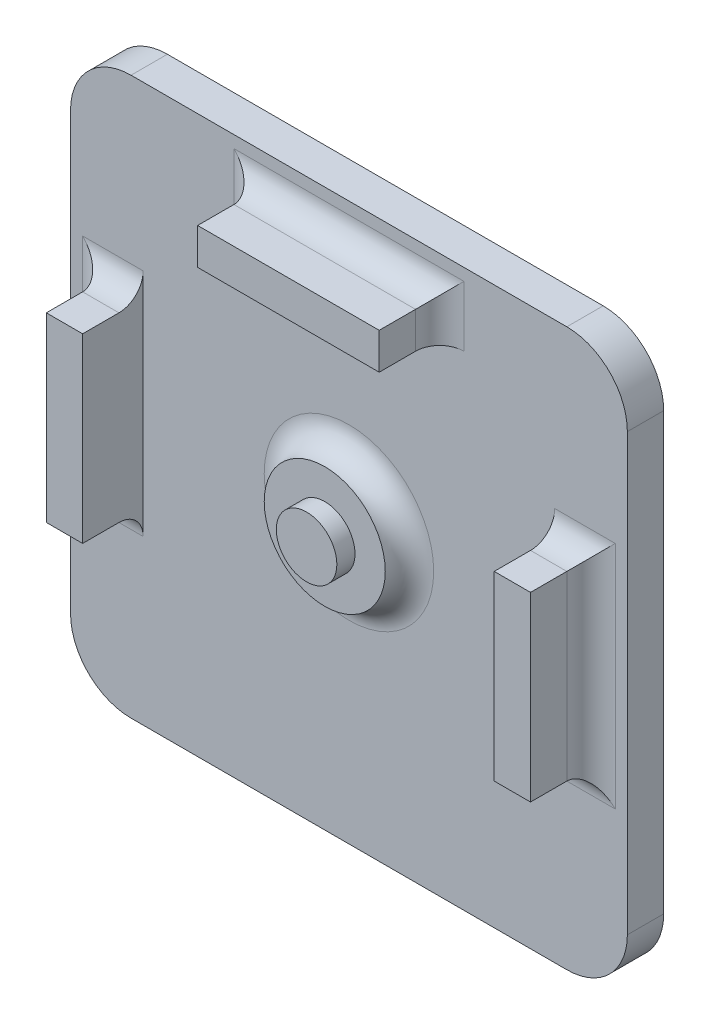
ISO-10303-21;
HEADER;
FILE_DESCRIPTION(('STEP AP214'),'2;1');
FILE_NAME('part.step','',(''),(''),'','','');
FILE_SCHEMA(('AUTOMOTIVE_DESIGN { 1 0 10303 214 1 1 1 1 }'));
ENDSEC;
DATA;
#1=APPLICATION_CONTEXT('core data for automotive mechanical design processes');
#2=APPLICATION_PROTOCOL_DEFINITION('international standard','automotive_design',2000,#1);
#3=PRODUCT_CONTEXT('',#1,'mechanical');
#4=PRODUCT('Part','Part','',(#3));
#5=PRODUCT_RELATED_PRODUCT_CATEGORY('part','',(#4));
#6=PRODUCT_DEFINITION_FORMATION('','',#4);
#7=PRODUCT_DEFINITION_CONTEXT('part definition',#1,'design');
#8=PRODUCT_DEFINITION('design','',#6,#7);
#9=PRODUCT_DEFINITION_SHAPE('','',#8);
#10=(LENGTH_UNIT() NAMED_UNIT(*) SI_UNIT(.MILLI.,.METRE.));
#11=(NAMED_UNIT(*) PLANE_ANGLE_UNIT() SI_UNIT($,.RADIAN.));
#12=(NAMED_UNIT(*) SI_UNIT($,.STERADIAN.) SOLID_ANGLE_UNIT());
#13=UNCERTAINTY_MEASURE_WITH_UNIT(LENGTH_MEASURE(1.E-05),#10,'distance_accuracy_value','');
#14=(GEOMETRIC_REPRESENTATION_CONTEXT(3) GLOBAL_UNCERTAINTY_ASSIGNED_CONTEXT((#13)) GLOBAL_UNIT_ASSIGNED_CONTEXT((#10,
#11,#12)) REPRESENTATION_CONTEXT('',''));
#15=CARTESIAN_POINT('',(0.,0.,0.));
#16=DIRECTION('',(0.,0.,1.));
#17=DIRECTION('',(1.,0.,0.));
#18=AXIS2_PLACEMENT_3D('',#15,#16,#17);
#19=CARTESIAN_POINT('',(0.,0.,3.));
#20=DIRECTION('',(0.,0.,-1.));
#21=DIRECTION('',(-1.,0.,0.));
#22=AXIS2_PLACEMENT_3D('',#19,#20,#21);
#23=PLANE('',#22);
#24=DIRECTION('',(0.,1.,0.));
#25=VECTOR('',#24,1.);
#26=CARTESIAN_POINT('',(32.5,40.,3.));
#27=LINE('',#26,#25);
#28=CARTESIAN_POINT('',(32.5,45.,3.));
#29=VERTEX_POINT('',#28);
#30=CARTESIAN_POINT('',(32.5,40.,3.));
#31=VERTEX_POINT('',#30);
#32=EDGE_CURVE('E430',#29,#31,#27,.F.);
#33=ORIENTED_EDGE('',*,*,#32,.T.);
#34=DIRECTION('',(1.,0.,0.));
#35=VECTOR('',#34,1.);
#36=CARTESIAN_POINT('',(15.5,40.,3.));
#37=LINE('',#36,#35);
#38=CARTESIAN_POINT('',(13.5,40.,3.));
#39=VERTEX_POINT('',#38);
#40=EDGE_CURVE('E273',#39,#31,#37,.T.);
#41=ORIENTED_EDGE('',*,*,#40,.F.);
#42=DIRECTION('',(0.,-1.,0.));
#43=VECTOR('',#42,1.);
#44=CARTESIAN_POINT('',(13.5,43.,3.));
#45=LINE('',#44,#43);
#46=CARTESIAN_POINT('',(13.5,45.,3.));
#47=VERTEX_POINT('',#46);
#48=EDGE_CURVE('E424',#39,#47,#45,.F.);
#49=ORIENTED_EDGE('',*,*,#48,.T.);
#50=DIRECTION('',(-1.,0.,0.));
#51=VECTOR('',#50,1.);
#52=CARTESIAN_POINT('',(30.5,45.,3.));
#53=LINE('',#52,#51);
#54=EDGE_CURVE('E427',#47,#29,#53,.F.);
#55=ORIENTED_EDGE('',*,*,#54,.T.);
#56=EDGE_LOOP('',(#33,#41,#49,#55));
#57=FACE_BOUND('',#56,.T.);
#58=DIRECTION('',(0.,-1.,0.));
#59=VECTOR('',#58,1.);
#60=CARTESIAN_POINT('',(0.,0.,3.));
#61=LINE('',#60,#59);
#62=CARTESIAN_POINT('',(0.,41.,3.));
#63=VERTEX_POINT('',#62);
#64=CARTESIAN_POINT('',(0.,5.,3.));
#65=VERTEX_POINT('',#64);
#66=EDGE_CURVE('E335',#63,#65,#61,.T.);
#67=ORIENTED_EDGE('',*,*,#66,.T.);
#68=CARTESIAN_POINT('',(5.,5.,3.));
#69=DIRECTION('',(0.,0.,-1.));
#70=DIRECTION('',(-1.,0.,0.));
#71=AXIS2_PLACEMENT_3D('',#68,#69,#70);
#72=CIRCLE('',#71,5.);
#73=CARTESIAN_POINT('',(5.,0.,3.));
#74=VERTEX_POINT('',#73);
#75=EDGE_CURVE('E399',#65,#74,#72,.F.);
#76=ORIENTED_EDGE('',*,*,#75,.T.);
#77=DIRECTION('',(1.,0.,0.));
#78=VECTOR('',#77,1.);
#79=CARTESIAN_POINT('',(0.,0.,3.));
#80=LINE('',#79,#78);
#81=CARTESIAN_POINT('',(41.,0.,3.));
#82=VERTEX_POINT('',#81);
#83=EDGE_CURVE('E339',#74,#82,#80,.T.);
#84=ORIENTED_EDGE('',*,*,#83,.T.);
#85=CARTESIAN_POINT('',(41.,5.,3.));
#86=DIRECTION('',(0.,0.,-1.));
#87=DIRECTION('',(-1.,0.,0.));
#88=AXIS2_PLACEMENT_3D('',#85,#86,#87);
#89=CIRCLE('',#88,5.);
#90=CARTESIAN_POINT('',(46.,5.,3.));
#91=VERTEX_POINT('',#90);
#92=EDGE_CURVE('E396',#82,#91,#89,.F.);
#93=ORIENTED_EDGE('',*,*,#92,.T.);
#94=DIRECTION('',(0.,1.,0.));
#95=VECTOR('',#94,1.);
#96=CARTESIAN_POINT('',(46.,0.,3.));
#97=LINE('',#96,#95);
#98=CARTESIAN_POINT('',(46.,41.,3.));
#99=VERTEX_POINT('',#98);
#100=EDGE_CURVE('E344',#91,#99,#97,.T.);
#101=ORIENTED_EDGE('',*,*,#100,.T.);
#102=CARTESIAN_POINT('',(41.,41.,3.));
#103=DIRECTION('',(0.,0.,-1.));
#104=DIRECTION('',(-1.,0.,0.));
#105=AXIS2_PLACEMENT_3D('',#102,#103,#104);
#106=CIRCLE('',#105,5.);
#107=CARTESIAN_POINT('',(41.,46.,3.));
#108=VERTEX_POINT('',#107);
#109=EDGE_CURVE('E393',#99,#108,#106,.F.);
#110=ORIENTED_EDGE('',*,*,#109,.T.);
#111=DIRECTION('',(-1.,0.,0.));
#112=VECTOR('',#111,1.);
#113=CARTESIAN_POINT('',(0.,46.,3.));
#114=LINE('',#113,#112);
#115=CARTESIAN_POINT('',(5.,46.,3.));
#116=VERTEX_POINT('',#115);
#117=EDGE_CURVE('E330',#108,#116,#114,.T.);
#118=ORIENTED_EDGE('',*,*,#117,.T.);
#119=CARTESIAN_POINT('',(5.,41.,3.));
#120=DIRECTION('',(0.,0.,-1.));
#121=DIRECTION('',(-1.,0.,0.));
#122=AXIS2_PLACEMENT_3D('',#119,#120,#121);
#123=CIRCLE('',#122,5.);
#124=EDGE_CURVE('E390',#116,#63,#123,.F.);
#125=ORIENTED_EDGE('',*,*,#124,.T.);
#126=EDGE_LOOP('',(#67,#76,#84,#93,#101,#110,#118,#125));
#127=FACE_BOUND('',#126,.T.);
#128=CARTESIAN_POINT('',(23.,23.,3.));
#129=DIRECTION('',(0.,0.,-1.));
#130=DIRECTION('',(-1.,0.,0.));
#131=AXIS2_PLACEMENT_3D('',#128,#129,#130);
#132=CIRCLE('',#131,7.);
#133=CARTESIAN_POINT('',(16.,23.,3.));
#134=VERTEX_POINT('',#133);
#135=EDGE_CURVE('E416',#134,#134,#132,.T.);
#136=ORIENTED_EDGE('',*,*,#135,.T.);
#137=EDGE_LOOP('',(#136));
#138=FACE_BOUND('',#137,.T.);
#139=DIRECTION('',(-1.,0.,0.));
#140=VECTOR('',#139,1.);
#141=CARTESIAN_POINT('',(5.99999999999999,32.5,3.));
#142=LINE('',#141,#140);
#143=CARTESIAN_POINT('',(0.999999999999992,32.5,3.));
#144=VERTEX_POINT('',#143);
#145=CARTESIAN_POINT('',(5.99999999999999,32.5,3.));
#146=VERTEX_POINT('',#145);
#147=EDGE_CURVE('E450',#144,#146,#142,.F.);
#148=ORIENTED_EDGE('',*,*,#147,.T.);
#149=DIRECTION('',(0.,1.,0.));
#150=VECTOR('',#149,1.);
#151=CARTESIAN_POINT('',(5.99999999999999,30.5,3.));
#152=LINE('',#151,#150);
#153=CARTESIAN_POINT('',(5.99999999999999,13.5,3.));
#154=VERTEX_POINT('',#153);
#155=EDGE_CURVE('E276',#154,#146,#152,.T.);
#156=ORIENTED_EDGE('',*,*,#155,.F.);
#157=DIRECTION('',(1.,0.,0.));
#158=VECTOR('',#157,1.);
#159=CARTESIAN_POINT('',(2.99999999999999,13.5,3.));
#160=LINE('',#159,#158);
#161=CARTESIAN_POINT('',(0.999999999999995,13.5,3.));
#162=VERTEX_POINT('',#161);
#163=EDGE_CURVE('E444',#154,#162,#160,.F.);
#164=ORIENTED_EDGE('',*,*,#163,.T.);
#165=DIRECTION('',(0.,-1.,0.));
#166=VECTOR('',#165,1.);
#167=CARTESIAN_POINT('',(0.999999999999993,30.5,3.));
#168=LINE('',#167,#166);
#169=EDGE_CURVE('E447',#162,#144,#168,.F.);
#170=ORIENTED_EDGE('',*,*,#169,.T.);
#171=EDGE_LOOP('',(#148,#156,#164,#170));
#172=FACE_BOUND('',#171,.T.);
#173=DIRECTION('',(1.,0.,0.));
#174=VECTOR('',#173,1.);
#175=CARTESIAN_POINT('',(40.,13.5,3.));
#176=LINE('',#175,#174);
#177=CARTESIAN_POINT('',(45.,13.5,3.));
#178=VERTEX_POINT('',#177);
#179=CARTESIAN_POINT('',(40.,13.5,3.));
#180=VERTEX_POINT('',#179);
#181=EDGE_CURVE('E440',#178,#180,#176,.F.);
#182=ORIENTED_EDGE('',*,*,#181,.T.);
#183=DIRECTION('',(0.,-1.,0.));
#184=VECTOR('',#183,1.);
#185=CARTESIAN_POINT('',(40.,30.5,3.));
#186=LINE('',#185,#184);
#187=CARTESIAN_POINT('',(40.,32.5,3.));
#188=VERTEX_POINT('',#187);
#189=EDGE_CURVE('E250',#188,#180,#186,.T.);
#190=ORIENTED_EDGE('',*,*,#189,.F.);
#191=DIRECTION('',(-1.,0.,0.));
#192=VECTOR('',#191,1.);
#193=CARTESIAN_POINT('',(43.,32.5,3.));
#194=LINE('',#193,#192);
#195=CARTESIAN_POINT('',(45.,32.5,3.));
#196=VERTEX_POINT('',#195);
#197=EDGE_CURVE('E437',#188,#196,#194,.F.);
#198=ORIENTED_EDGE('',*,*,#197,.T.);
#199=DIRECTION('',(0.,1.,0.));
#200=VECTOR('',#199,1.);
#201=CARTESIAN_POINT('',(45.,15.5,3.));
#202=LINE('',#201,#200);
#203=EDGE_CURVE('E434',#196,#178,#202,.F.);
#204=ORIENTED_EDGE('',*,*,#203,.T.);
#205=EDGE_LOOP('',(#182,#190,#198,#204));
#206=FACE_BOUND('',#205,.T.);
#207=ADVANCED_FACE('F43',(#57,#127,#138,#172,#206),#23,.F.);
#208=CARTESIAN_POINT('',(0.,0.,3.));
#209=DIRECTION('',(1.,0.,0.));
#210=DIRECTION('',(0.,0.,-1.));
#211=AXIS2_PLACEMENT_3D('',#208,#209,#210);
#212=PLANE('',#211);
#213=DIRECTION('',(0.,-1.,0.));
#214=VECTOR('',#213,1.);
#215=CARTESIAN_POINT('',(0.,0.,0.));
#216=LINE('',#215,#214);
#217=CARTESIAN_POINT('',(0.,41.,0.));
#218=VERTEX_POINT('',#217);
#219=CARTESIAN_POINT('',(0.,5.,0.));
#220=VERTEX_POINT('',#219);
#221=EDGE_CURVE('E334',#218,#220,#216,.T.);
#222=ORIENTED_EDGE('',*,*,#221,.T.);
#223=DIRECTION('',(0.,0.,-1.));
#224=VECTOR('',#223,1.);
#225=CARTESIAN_POINT('',(0.,5.,3.));
#226=LINE('',#225,#224);
#227=EDGE_CURVE('E387',#220,#65,#226,.F.);
#228=ORIENTED_EDGE('',*,*,#227,.T.);
#229=ORIENTED_EDGE('',*,*,#66,.F.);
#230=DIRECTION('',(0.,0.,-1.));
#231=VECTOR('',#230,1.);
#232=CARTESIAN_POINT('',(0.,41.,3.));
#233=LINE('',#232,#231);
#234=EDGE_CURVE('E383',#63,#218,#233,.T.);
#235=ORIENTED_EDGE('',*,*,#234,.T.);
#236=EDGE_LOOP('',(#222,#228,#229,#235));
#237=FACE_BOUND('',#236,.T.);
#238=ADVANCED_FACE('F542',(#237),#212,.F.);
#239=CARTESIAN_POINT('',(0.,0.,3.));
#240=DIRECTION('',(0.,1.,0.));
#241=DIRECTION('',(0.,0.,1.));
#242=AXIS2_PLACEMENT_3D('',#239,#240,#241);
#243=PLANE('',#242);
#244=ORIENTED_EDGE('',*,*,#83,.F.);
#245=DIRECTION('',(0.,0.,-1.));
#246=VECTOR('',#245,1.);
#247=CARTESIAN_POINT('',(5.,0.,3.));
#248=LINE('',#247,#246);
#249=CARTESIAN_POINT('',(5.,0.,0.));
#250=VERTEX_POINT('',#249);
#251=EDGE_CURVE('E367',#74,#250,#248,.T.);
#252=ORIENTED_EDGE('',*,*,#251,.T.);
#253=DIRECTION('',(1.,0.,0.));
#254=VECTOR('',#253,1.);
#255=CARTESIAN_POINT('',(0.,0.,0.));
#256=LINE('',#255,#254);
#257=CARTESIAN_POINT('',(41.,0.,0.));
#258=VERTEX_POINT('',#257);
#259=EDGE_CURVE('E354',#250,#258,#256,.T.);
#260=ORIENTED_EDGE('',*,*,#259,.T.);
#261=DIRECTION('',(0.,0.,-1.));
#262=VECTOR('',#261,1.);
#263=CARTESIAN_POINT('',(41.,0.,3.));
#264=LINE('',#263,#262);
#265=EDGE_CURVE('E329',#258,#82,#264,.F.);
#266=ORIENTED_EDGE('',*,*,#265,.T.);
#267=EDGE_LOOP('',(#244,#252,#260,#266));
#268=FACE_BOUND('',#267,.T.);
#269=ADVANCED_FACE('F550',(#268),#243,.F.);
#270=CARTESIAN_POINT('',(46.,0.,3.));
#271=DIRECTION('',(-1.,0.,0.));
#272=DIRECTION('',(0.,0.,1.));
#273=AXIS2_PLACEMENT_3D('',#270,#271,#272);
#274=PLANE('',#273);
#275=ORIENTED_EDGE('',*,*,#100,.F.);
#276=DIRECTION('',(0.,0.,-1.));
#277=VECTOR('',#276,1.);
#278=CARTESIAN_POINT('',(46.,5.,3.));
#279=LINE('',#278,#277);
#280=CARTESIAN_POINT('',(46.,5.,0.));
#281=VERTEX_POINT('',#280);
#282=EDGE_CURVE('E405',#91,#281,#279,.T.);
#283=ORIENTED_EDGE('',*,*,#282,.T.);
#284=DIRECTION('',(0.,1.,0.));
#285=VECTOR('',#284,1.);
#286=CARTESIAN_POINT('',(46.,0.,0.));
#287=LINE('',#286,#285);
#288=CARTESIAN_POINT('',(46.,41.,0.));
#289=VERTEX_POINT('',#288);
#290=EDGE_CURVE('E358',#281,#289,#287,.T.);
#291=ORIENTED_EDGE('',*,*,#290,.T.);
#292=DIRECTION('',(0.,0.,-1.));
#293=VECTOR('',#292,1.);
#294=CARTESIAN_POINT('',(46.,41.,3.));
#295=LINE('',#294,#293);
#296=EDGE_CURVE('E402',#289,#99,#295,.F.);
#297=ORIENTED_EDGE('',*,*,#296,.T.);
#298=EDGE_LOOP('',(#275,#283,#291,#297));
#299=FACE_BOUND('',#298,.T.);
#300=ADVANCED_FACE('F565',(#299),#274,.F.);
#301=CARTESIAN_POINT('',(0.,46.,3.));
#302=DIRECTION('',(0.,-1.,0.));
#303=DIRECTION('',(0.,0.,-1.));
#304=AXIS2_PLACEMENT_3D('',#301,#302,#303);
#305=PLANE('',#304);
#306=ORIENTED_EDGE('',*,*,#117,.F.);
#307=DIRECTION('',(0.,0.,-1.));
#308=VECTOR('',#307,1.);
#309=CARTESIAN_POINT('',(41.,46.,3.));
#310=LINE('',#309,#308);
#311=CARTESIAN_POINT('',(41.,46.,0.));
#312=VERTEX_POINT('',#311);
#313=EDGE_CURVE('E412',#108,#312,#310,.T.);
#314=ORIENTED_EDGE('',*,*,#313,.T.);
#315=DIRECTION('',(-1.,0.,0.));
#316=VECTOR('',#315,1.);
#317=CARTESIAN_POINT('',(0.,46.,0.));
#318=LINE('',#317,#316);
#319=CARTESIAN_POINT('',(5.,46.,0.));
#320=VERTEX_POINT('',#319);
#321=EDGE_CURVE('E340',#312,#320,#318,.T.);
#322=ORIENTED_EDGE('',*,*,#321,.T.);
#323=DIRECTION('',(0.,0.,-1.));
#324=VECTOR('',#323,1.);
#325=CARTESIAN_POINT('',(5.,46.,3.));
#326=LINE('',#325,#324);
#327=EDGE_CURVE('E409',#320,#116,#326,.F.);
#328=ORIENTED_EDGE('',*,*,#327,.T.);
#329=EDGE_LOOP('',(#306,#314,#322,#328));
#330=FACE_BOUND('',#329,.T.);
#331=ADVANCED_FACE('F561',(#330),#305,.F.);
#332=CARTESIAN_POINT('',(0.,0.,0.));
#333=DIRECTION('',(0.,0.,-1.));
#334=DIRECTION('',(-1.,0.,0.));
#335=AXIS2_PLACEMENT_3D('',#332,#333,#334);
#336=PLANE('',#335);
#337=ORIENTED_EDGE('',*,*,#259,.F.);
#338=CARTESIAN_POINT('',(5.,5.,0.));
#339=DIRECTION('',(0.,0.,-1.));
#340=DIRECTION('',(-1.,0.,0.));
#341=AXIS2_PLACEMENT_3D('',#338,#339,#340);
#342=CIRCLE('',#341,5.);
#343=EDGE_CURVE('E380',#250,#220,#342,.T.);
#344=ORIENTED_EDGE('',*,*,#343,.T.);
#345=ORIENTED_EDGE('',*,*,#221,.F.);
#346=CARTESIAN_POINT('',(5.,41.,0.));
#347=DIRECTION('',(0.,0.,-1.));
#348=DIRECTION('',(-1.,0.,0.));
#349=AXIS2_PLACEMENT_3D('',#346,#347,#348);
#350=CIRCLE('',#349,5.);
#351=EDGE_CURVE('E371',#218,#320,#350,.T.);
#352=ORIENTED_EDGE('',*,*,#351,.T.);
#353=ORIENTED_EDGE('',*,*,#321,.F.);
#354=CARTESIAN_POINT('',(41.,41.,0.));
#355=DIRECTION('',(0.,0.,-1.));
#356=DIRECTION('',(-1.,0.,0.));
#357=AXIS2_PLACEMENT_3D('',#354,#355,#356);
#358=CIRCLE('',#357,5.);
#359=EDGE_CURVE('E374',#312,#289,#358,.T.);
#360=ORIENTED_EDGE('',*,*,#359,.T.);
#361=ORIENTED_EDGE('',*,*,#290,.F.);
#362=CARTESIAN_POINT('',(41.,5.,0.));
#363=DIRECTION('',(0.,0.,-1.));
#364=DIRECTION('',(-1.,0.,0.));
#365=AXIS2_PLACEMENT_3D('',#362,#363,#364);
#366=CIRCLE('',#365,5.);
#367=EDGE_CURVE('E377',#281,#258,#366,.T.);
#368=ORIENTED_EDGE('',*,*,#367,.T.);
#369=EDGE_LOOP('',(#337,#344,#345,#352,#353,#360,#361,#368));
#370=FACE_BOUND('',#369,.T.);
#371=ADVANCED_FACE('F558',(#370),#336,.T.);
#372=CARTESIAN_POINT('',(23.,23.,5.));
#373=DIRECTION('',(0.,0.,1.));
#374=DIRECTION('',(1.,0.,0.));
#375=AXIS2_PLACEMENT_3D('',#372,#373,#374);
#376=PLANE('',#375);
#377=CARTESIAN_POINT('',(23.,23.,5.));
#378=DIRECTION('',(0.,0.,1.));
#379=DIRECTION('',(1.,0.,0.));
#380=AXIS2_PLACEMENT_3D('',#377,#378,#379);
#381=CIRCLE('',#380,2.5);
#382=CARTESIAN_POINT('',(25.5,23.,5.));
#383=VERTEX_POINT('',#382);
#384=EDGE_CURVE('E325',#383,#383,#381,.T.);
#385=ORIENTED_EDGE('',*,*,#384,.F.);
#386=EDGE_LOOP('',(#385));
#387=FACE_BOUND('',#386,.T.);
#388=CARTESIAN_POINT('',(23.,23.,5.));
#389=DIRECTION('',(0.,0.,1.));
#390=DIRECTION('',(1.,0.,0.));
#391=AXIS2_PLACEMENT_3D('',#388,#389,#390);
#392=CIRCLE('',#391,5.);
#393=CARTESIAN_POINT('',(28.,23.,5.));
#394=VERTEX_POINT('',#393);
#395=EDGE_CURVE('E324',#394,#394,#392,.T.);
#396=ORIENTED_EDGE('',*,*,#395,.T.);
#397=EDGE_LOOP('',(#396));
#398=FACE_BOUND('',#397,.T.);
#399=ADVANCED_FACE('F556',(#387,#398),#376,.T.);
#400=CARTESIAN_POINT('',(23.,23.,6.5));
#401=DIRECTION('',(0.,0.,-1.));
#402=DIRECTION('',(-1.,0.,0.));
#403=AXIS2_PLACEMENT_3D('',#400,#401,#402);
#404=CYLINDRICAL_SURFACE('',#403,2.5);
#405=CARTESIAN_POINT('',(23.,23.,6.5));
#406=DIRECTION('',(0.,0.,1.));
#407=DIRECTION('',(1.,0.,0.));
#408=AXIS2_PLACEMENT_3D('',#405,#406,#407);
#409=CIRCLE('',#408,2.5);
#410=CARTESIAN_POINT('',(25.5,23.,6.5));
#411=VERTEX_POINT('',#410);
#412=EDGE_CURVE('E320',#411,#411,#409,.T.);
#413=ORIENTED_EDGE('',*,*,#412,.F.);
#414=EDGE_LOOP('',(#413));
#415=FACE_BOUND('',#414,.T.);
#416=ORIENTED_EDGE('',*,*,#384,.T.);
#417=EDGE_LOOP('',(#416));
#418=FACE_BOUND('',#417,.T.);
#419=ADVANCED_FACE('F773',(#415,#418),#404,.T.);
#420=CARTESIAN_POINT('',(23.,23.,6.5));
#421=DIRECTION('',(0.,0.,1.));
#422=DIRECTION('',(1.,0.,0.));
#423=AXIS2_PLACEMENT_3D('',#420,#421,#422);
#424=PLANE('',#423);
#425=ORIENTED_EDGE('',*,*,#412,.T.);
#426=EDGE_LOOP('',(#425));
#427=FACE_BOUND('',#426,.T.);
#428=ADVANCED_FACE('F577',(#427),#424,.T.);
#429=CARTESIAN_POINT('',(5.,5.,3.));
#430=DIRECTION('',(0.,0.,-1.));
#431=DIRECTION('',(-1.,0.,0.));
#432=AXIS2_PLACEMENT_3D('',#429,#430,#431);
#433=CYLINDRICAL_SURFACE('',#432,5.);
#434=ORIENTED_EDGE('',*,*,#75,.F.);
#435=ORIENTED_EDGE('',*,*,#227,.F.);
#436=ORIENTED_EDGE('',*,*,#343,.F.);
#437=ORIENTED_EDGE('',*,*,#251,.F.);
#438=EDGE_LOOP('',(#434,#435,#436,#437));
#439=FACE_BOUND('',#438,.T.);
#440=ADVANCED_FACE('F573',(#439),#433,.T.);
#441=CARTESIAN_POINT('',(41.,5.,3.));
#442=DIRECTION('',(0.,0.,-1.));
#443=DIRECTION('',(-1.,0.,0.));
#444=AXIS2_PLACEMENT_3D('',#441,#442,#443);
#445=CYLINDRICAL_SURFACE('',#444,5.);
#446=ORIENTED_EDGE('',*,*,#92,.F.);
#447=ORIENTED_EDGE('',*,*,#265,.F.);
#448=ORIENTED_EDGE('',*,*,#367,.F.);
#449=ORIENTED_EDGE('',*,*,#282,.F.);
#450=EDGE_LOOP('',(#446,#447,#448,#449));
#451=FACE_BOUND('',#450,.T.);
#452=ADVANCED_FACE('F576',(#451),#445,.T.);
#453=CARTESIAN_POINT('',(41.,41.,3.));
#454=DIRECTION('',(0.,0.,-1.));
#455=DIRECTION('',(-1.,0.,0.));
#456=AXIS2_PLACEMENT_3D('',#453,#454,#455);
#457=CYLINDRICAL_SURFACE('',#456,5.);
#458=ORIENTED_EDGE('',*,*,#109,.F.);
#459=ORIENTED_EDGE('',*,*,#296,.F.);
#460=ORIENTED_EDGE('',*,*,#359,.F.);
#461=ORIENTED_EDGE('',*,*,#313,.F.);
#462=EDGE_LOOP('',(#458,#459,#460,#461));
#463=FACE_BOUND('',#462,.T.);
#464=ADVANCED_FACE('F581',(#463),#457,.T.);
#465=CARTESIAN_POINT('',(5.,41.,3.));
#466=DIRECTION('',(0.,0.,-1.));
#467=DIRECTION('',(-1.,0.,0.));
#468=AXIS2_PLACEMENT_3D('',#465,#466,#467);
#469=CYLINDRICAL_SURFACE('',#468,5.);
#470=ORIENTED_EDGE('',*,*,#124,.F.);
#471=ORIENTED_EDGE('',*,*,#327,.F.);
#472=ORIENTED_EDGE('',*,*,#351,.F.);
#473=ORIENTED_EDGE('',*,*,#234,.F.);
#474=EDGE_LOOP('',(#470,#471,#472,#473));
#475=FACE_BOUND('',#474,.T.);
#476=ADVANCED_FACE('F585',(#475),#469,.T.);
#477=CARTESIAN_POINT('',(23.,23.,5.));
#478=DIRECTION('',(0.,0.,-1.));
#479=DIRECTION('',(-1.,0.,0.));
#480=AXIS2_PLACEMENT_3D('',#477,#478,#479);
#481=TOROIDAL_SURFACE('',#480,7.,2.);
#482=ORIENTED_EDGE('',*,*,#135,.F.);
#483=EDGE_LOOP('',(#482));
#484=FACE_BOUND('',#483,.T.);
#485=ORIENTED_EDGE('',*,*,#395,.F.);
#486=EDGE_LOOP('',(#485));
#487=FACE_BOUND('',#486,.T.);
#488=ADVANCED_FACE('F589',(#484,#487),#481,.F.);
#489=CARTESIAN_POINT('',(5.99999999999999,30.5,8.));
#490=DIRECTION('',(-1.,0.,0.));
#491=DIRECTION('',(0.,-1.,0.));
#492=AXIS2_PLACEMENT_3D('',#489,#490,#491);
#493=PLANE('',#492);
#494=ORIENTED_EDGE('',*,*,#155,.T.);
#495=CARTESIAN_POINT('',(5.99999999999999,32.5,5.));
#496=DIRECTION('',(-1.,0.,0.));
#497=DIRECTION('',(0.,-1.,0.));
#498=AXIS2_PLACEMENT_3D('',#495,#496,#497);
#499=CIRCLE('',#498,2.);
#500=CARTESIAN_POINT('',(5.99999999999999,30.5,5.));
#501=VERTEX_POINT('',#500);
#502=EDGE_CURVE('E477',#146,#501,#499,.T.);
#503=ORIENTED_EDGE('',*,*,#502,.T.);
#504=DIRECTION('',(0.,0.,-1.));
#505=VECTOR('',#504,1.);
#506=CARTESIAN_POINT('',(5.99999999999999,30.5,8.));
#507=LINE('',#506,#505);
#508=CARTESIAN_POINT('',(5.99999999999999,30.5,8.));
#509=VERTEX_POINT('',#508);
#510=EDGE_CURVE('E316',#509,#501,#507,.T.);
#511=ORIENTED_EDGE('',*,*,#510,.F.);
#512=DIRECTION('',(0.,1.,0.));
#513=VECTOR('',#512,1.);
#514=CARTESIAN_POINT('',(5.99999999999999,30.5,8.));
#515=LINE('',#514,#513);
#516=CARTESIAN_POINT('',(5.99999999999999,15.5,8.));
#517=VERTEX_POINT('',#516);
#518=EDGE_CURVE('E289',#517,#509,#515,.T.);
#519=ORIENTED_EDGE('',*,*,#518,.F.);
#520=DIRECTION('',(0.,0.,-1.));
#521=VECTOR('',#520,1.);
#522=CARTESIAN_POINT('',(5.99999999999999,15.5,8.));
#523=LINE('',#522,#521);
#524=CARTESIAN_POINT('',(5.99999999999999,15.5,5.));
#525=VERTEX_POINT('',#524);
#526=EDGE_CURVE('E302',#517,#525,#523,.T.);
#527=ORIENTED_EDGE('',*,*,#526,.T.);
#528=CARTESIAN_POINT('',(5.99999999999999,13.5,5.));
#529=DIRECTION('',(-1.,0.,0.));
#530=DIRECTION('',(0.,-1.,0.));
#531=AXIS2_PLACEMENT_3D('',#528,#529,#530);
#532=CIRCLE('',#531,2.);
#533=EDGE_CURVE('E480',#525,#154,#532,.T.);
#534=ORIENTED_EDGE('',*,*,#533,.T.);
#535=EDGE_LOOP('',(#494,#503,#511,#519,#527,#534));
#536=FACE_BOUND('',#535,.T.);
#537=ADVANCED_FACE('F593',(#536),#493,.F.);
#538=CARTESIAN_POINT('',(5.99999999999999,30.5,8.));
#539=DIRECTION('',(0.,-1.,0.));
#540=DIRECTION('',(0.,0.,-1.));
#541=AXIS2_PLACEMENT_3D('',#538,#539,#540);
#542=PLANE('',#541);
#543=ORIENTED_EDGE('',*,*,#510,.T.);
#544=DIRECTION('',(-1.,0.,0.));
#545=VECTOR('',#544,1.);
#546=CARTESIAN_POINT('',(2.99999999999999,30.5,5.));
#547=LINE('',#546,#545);
#548=CARTESIAN_POINT('',(2.99999999999999,30.5,5.));
#549=VERTEX_POINT('',#548);
#550=EDGE_CURVE('E420',#501,#549,#547,.T.);
#551=ORIENTED_EDGE('',*,*,#550,.T.);
#552=DIRECTION('',(0.,0.,-1.));
#553=VECTOR('',#552,1.);
#554=CARTESIAN_POINT('',(2.99999999999999,30.5,8.));
#555=LINE('',#554,#553);
#556=CARTESIAN_POINT('',(2.99999999999999,30.5,8.));
#557=VERTEX_POINT('',#556);
#558=EDGE_CURVE('E312',#557,#549,#555,.T.);
#559=ORIENTED_EDGE('',*,*,#558,.F.);
#560=DIRECTION('',(-1.,0.,0.));
#561=VECTOR('',#560,1.);
#562=CARTESIAN_POINT('',(5.99999999999999,30.5,8.));
#563=LINE('',#562,#561);
#564=EDGE_CURVE('E293',#509,#557,#563,.T.);
#565=ORIENTED_EDGE('',*,*,#564,.F.);
#566=EDGE_LOOP('',(#543,#551,#559,#565));
#567=FACE_BOUND('',#566,.T.);
#568=ADVANCED_FACE('F832',(#567),#542,.F.);
#569=CARTESIAN_POINT('',(2.99999999999999,30.5,8.));
#570=DIRECTION('',(1.,0.,0.));
#571=DIRECTION('',(0.,1.,0.));
#572=AXIS2_PLACEMENT_3D('',#569,#570,#571);
#573=PLANE('',#572);
#574=ORIENTED_EDGE('',*,*,#558,.T.);
#575=DIRECTION('',(0.,-1.,0.));
#576=VECTOR('',#575,1.);
#577=CARTESIAN_POINT('',(2.99999999999999,15.5,5.));
#578=LINE('',#577,#576);
#579=CARTESIAN_POINT('',(2.99999999999999,15.5,5.));
#580=VERTEX_POINT('',#579);
#581=EDGE_CURVE('E454',#549,#580,#578,.T.);
#582=ORIENTED_EDGE('',*,*,#581,.T.);
#583=DIRECTION('',(0.,0.,-1.));
#584=VECTOR('',#583,1.);
#585=CARTESIAN_POINT('',(2.99999999999999,15.5,8.));
#586=LINE('',#585,#584);
#587=CARTESIAN_POINT('',(2.99999999999999,15.5,8.));
#588=VERTEX_POINT('',#587);
#589=EDGE_CURVE('E308',#588,#580,#586,.T.);
#590=ORIENTED_EDGE('',*,*,#589,.F.);
#591=DIRECTION('',(0.,-1.,0.));
#592=VECTOR('',#591,1.);
#593=CARTESIAN_POINT('',(2.99999999999999,30.5,8.));
#594=LINE('',#593,#592);
#595=EDGE_CURVE('E296',#557,#588,#594,.T.);
#596=ORIENTED_EDGE('',*,*,#595,.F.);
#597=EDGE_LOOP('',(#574,#582,#590,#596));
#598=FACE_BOUND('',#597,.T.);
#599=ADVANCED_FACE('F841',(#598),#573,.F.);
#600=CARTESIAN_POINT('',(5.99999999999999,15.5,8.));
#601=DIRECTION('',(0.,1.,0.));
#602=DIRECTION('',(0.,0.,1.));
#603=AXIS2_PLACEMENT_3D('',#600,#601,#602);
#604=PLANE('',#603);
#605=ORIENTED_EDGE('',*,*,#589,.T.);
#606=DIRECTION('',(1.,0.,0.));
#607=VECTOR('',#606,1.);
#608=CARTESIAN_POINT('',(5.99999999999999,15.5,5.));
#609=LINE('',#608,#607);
#610=EDGE_CURVE('E457',#580,#525,#609,.T.);
#611=ORIENTED_EDGE('',*,*,#610,.T.);
#612=ORIENTED_EDGE('',*,*,#526,.F.);
#613=DIRECTION('',(1.,0.,0.));
#614=VECTOR('',#613,1.);
#615=CARTESIAN_POINT('',(5.99999999999999,15.5,8.));
#616=LINE('',#615,#614);
#617=EDGE_CURVE('E299',#588,#517,#616,.T.);
#618=ORIENTED_EDGE('',*,*,#617,.F.);
#619=EDGE_LOOP('',(#605,#611,#612,#618));
#620=FACE_BOUND('',#619,.T.);
#621=ADVANCED_FACE('F700',(#620),#604,.F.);
#622=CARTESIAN_POINT('',(0.,0.,8.));
#623=DIRECTION('',(0.,0.,-1.));
#624=DIRECTION('',(-1.,0.,0.));
#625=AXIS2_PLACEMENT_3D('',#622,#623,#624);
#626=PLANE('',#625);
#627=ORIENTED_EDGE('',*,*,#518,.T.);
#628=ORIENTED_EDGE('',*,*,#564,.T.);
#629=ORIENTED_EDGE('',*,*,#595,.T.);
#630=ORIENTED_EDGE('',*,*,#617,.T.);
#631=EDGE_LOOP('',(#627,#628,#629,#630));
#632=FACE_BOUND('',#631,.T.);
#633=ADVANCED_FACE('F695',(#632),#626,.F.);
#634=CARTESIAN_POINT('',(15.5,40.,8.));
#635=DIRECTION('',(1.,0.,0.));
#636=DIRECTION('',(0.,0.,-1.));
#637=AXIS2_PLACEMENT_3D('',#634,#635,#636);
#638=PLANE('',#637);
#639=DIRECTION('',(0.,0.,-1.));
#640=VECTOR('',#639,1.);
#641=CARTESIAN_POINT('',(15.5,43.,8.));
#642=LINE('',#641,#640);
#643=CARTESIAN_POINT('',(15.5,43.,8.));
#644=VERTEX_POINT('',#643);
#645=CARTESIAN_POINT('',(15.5,43.,5.));
#646=VERTEX_POINT('',#645);
#647=EDGE_CURVE('E269',#644,#646,#642,.T.);
#648=ORIENTED_EDGE('',*,*,#647,.T.);
#649=DIRECTION('',(0.,-1.,0.));
#650=VECTOR('',#649,1.);
#651=CARTESIAN_POINT('',(15.5,40.,5.));
#652=LINE('',#651,#650);
#653=CARTESIAN_POINT('',(15.5,40.,5.));
#654=VERTEX_POINT('',#653);
#655=EDGE_CURVE('E61',#646,#654,#652,.T.);
#656=ORIENTED_EDGE('',*,*,#655,.T.);
#657=DIRECTION('',(0.,0.,-1.));
#658=VECTOR('',#657,1.);
#659=CARTESIAN_POINT('',(15.5,40.,8.));
#660=LINE('',#659,#658);
#661=CARTESIAN_POINT('',(15.5,40.,8.));
#662=VERTEX_POINT('',#661);
#663=EDGE_CURVE('E255',#662,#654,#660,.T.);
#664=ORIENTED_EDGE('',*,*,#663,.F.);
#665=DIRECTION('',(0.,-1.,0.));
#666=VECTOR('',#665,1.);
#667=CARTESIAN_POINT('',(15.5,40.,8.));
#668=LINE('',#667,#666);
#669=EDGE_CURVE('E277',#644,#662,#668,.T.);
#670=ORIENTED_EDGE('',*,*,#669,.F.);
#671=EDGE_LOOP('',(#648,#656,#664,#670));
#672=FACE_BOUND('',#671,.T.);
#673=ADVANCED_FACE('F524',(#672),#638,.F.);
#674=CARTESIAN_POINT('',(15.5,40.,8.));
#675=DIRECTION('',(0.,1.,0.));
#676=DIRECTION('',(0.,0.,1.));
#677=AXIS2_PLACEMENT_3D('',#674,#675,#676);
#678=PLANE('',#677);
#679=ORIENTED_EDGE('',*,*,#40,.T.);
#680=CARTESIAN_POINT('',(32.5,40.,5.));
#681=DIRECTION('',(0.,1.,0.));
#682=DIRECTION('',(0.,0.,1.));
#683=AXIS2_PLACEMENT_3D('',#680,#681,#682);
#684=CIRCLE('',#683,2.);
#685=CARTESIAN_POINT('',(30.5,40.,5.));
#686=VERTEX_POINT('',#685);
#687=EDGE_CURVE('E53',#31,#686,#684,.T.);
#688=ORIENTED_EDGE('',*,*,#687,.T.);
#689=DIRECTION('',(0.,0.,-1.));
#690=VECTOR('',#689,1.);
#691=CARTESIAN_POINT('',(30.5,40.,8.));
#692=LINE('',#691,#690);
#693=CARTESIAN_POINT('',(30.5,40.,8.));
#694=VERTEX_POINT('',#693);
#695=EDGE_CURVE('E262',#694,#686,#692,.T.);
#696=ORIENTED_EDGE('',*,*,#695,.F.);
#697=DIRECTION('',(1.,0.,0.));
#698=VECTOR('',#697,1.);
#699=CARTESIAN_POINT('',(15.5,40.,8.));
#700=LINE('',#699,#698);
#701=EDGE_CURVE('E283',#662,#694,#700,.T.);
#702=ORIENTED_EDGE('',*,*,#701,.F.);
#703=ORIENTED_EDGE('',*,*,#663,.T.);
#704=CARTESIAN_POINT('',(13.5,40.,5.));
#705=DIRECTION('',(0.,1.,0.));
#706=DIRECTION('',(0.,0.,1.));
#707=AXIS2_PLACEMENT_3D('',#704,#705,#706);
#708=CIRCLE('',#707,2.);
#709=EDGE_CURVE('E11',#654,#39,#708,.T.);
#710=ORIENTED_EDGE('',*,*,#709,.T.);
#711=EDGE_LOOP('',(#679,#688,#696,#702,#703,#710));
#712=FACE_BOUND('',#711,.T.);
#713=ADVANCED_FACE('F521',(#712),#678,.F.);
#714=CARTESIAN_POINT('',(30.5,40.,8.));
#715=DIRECTION('',(-1.,0.,0.));
#716=DIRECTION('',(0.,0.,1.));
#717=AXIS2_PLACEMENT_3D('',#714,#715,#716);
#718=PLANE('',#717);
#719=ORIENTED_EDGE('',*,*,#695,.T.);
#720=DIRECTION('',(0.,1.,0.));
#721=VECTOR('',#720,1.);
#722=CARTESIAN_POINT('',(30.5,43.,5.));
#723=LINE('',#722,#721);
#724=CARTESIAN_POINT('',(30.5,43.,5.));
#725=VERTEX_POINT('',#724);
#726=EDGE_CURVE('E469',#686,#725,#723,.T.);
#727=ORIENTED_EDGE('',*,*,#726,.T.);
#728=DIRECTION('',(0.,0.,-1.));
#729=VECTOR('',#728,1.);
#730=CARTESIAN_POINT('',(30.5,43.,8.));
#731=LINE('',#730,#729);
#732=CARTESIAN_POINT('',(30.5,43.,8.));
#733=VERTEX_POINT('',#732);
#734=EDGE_CURVE('E266',#733,#725,#731,.T.);
#735=ORIENTED_EDGE('',*,*,#734,.F.);
#736=DIRECTION('',(0.,1.,0.));
#737=VECTOR('',#736,1.);
#738=CARTESIAN_POINT('',(30.5,40.,8.));
#739=LINE('',#738,#737);
#740=EDGE_CURVE('E280',#694,#733,#739,.T.);
#741=ORIENTED_EDGE('',*,*,#740,.F.);
#742=EDGE_LOOP('',(#719,#727,#735,#741));
#743=FACE_BOUND('',#742,.T.);
#744=ADVANCED_FACE('F532',(#743),#718,.F.);
#745=CARTESIAN_POINT('',(15.5,43.,8.));
#746=DIRECTION('',(0.,-1.,0.));
#747=DIRECTION('',(0.,0.,-1.));
#748=AXIS2_PLACEMENT_3D('',#745,#746,#747);
#749=PLANE('',#748);
#750=ORIENTED_EDGE('',*,*,#734,.T.);
#751=DIRECTION('',(-1.,0.,0.));
#752=VECTOR('',#751,1.);
#753=CARTESIAN_POINT('',(15.5,43.,5.));
#754=LINE('',#753,#752);
#755=EDGE_CURVE('E69',#725,#646,#754,.T.);
#756=ORIENTED_EDGE('',*,*,#755,.T.);
#757=ORIENTED_EDGE('',*,*,#647,.F.);
#758=DIRECTION('',(-1.,0.,0.));
#759=VECTOR('',#758,1.);
#760=CARTESIAN_POINT('',(15.5,43.,8.));
#761=LINE('',#760,#759);
#762=EDGE_CURVE('E272',#733,#644,#761,.T.);
#763=ORIENTED_EDGE('',*,*,#762,.F.);
#764=EDGE_LOOP('',(#750,#756,#757,#763));
#765=FACE_BOUND('',#764,.T.);
#766=ADVANCED_FACE('F530',(#765),#749,.F.);
#767=CARTESIAN_POINT('',(0.,0.,8.));
#768=DIRECTION('',(0.,0.,-1.));
#769=DIRECTION('',(-1.,0.,0.));
#770=AXIS2_PLACEMENT_3D('',#767,#768,#769);
#771=PLANE('',#770);
#772=ORIENTED_EDGE('',*,*,#669,.T.);
#773=ORIENTED_EDGE('',*,*,#701,.T.);
#774=ORIENTED_EDGE('',*,*,#740,.T.);
#775=ORIENTED_EDGE('',*,*,#762,.T.);
#776=EDGE_LOOP('',(#772,#773,#774,#775));
#777=FACE_BOUND('',#776,.T.);
#778=ADVANCED_FACE('F526',(#777),#771,.F.);
#779=CARTESIAN_POINT('',(40.,30.5,8.));
#780=DIRECTION('',(1.,0.,0.));
#781=DIRECTION('',(0.,1.,0.));
#782=AXIS2_PLACEMENT_3D('',#779,#780,#781);
#783=PLANE('',#782);
#784=ORIENTED_EDGE('',*,*,#189,.T.);
#785=CARTESIAN_POINT('',(40.,13.5,5.));
#786=DIRECTION('',(1.,0.,0.));
#787=DIRECTION('',(0.,1.,0.));
#788=AXIS2_PLACEMENT_3D('',#785,#786,#787);
#789=CIRCLE('',#788,2.);
#790=CARTESIAN_POINT('',(40.,15.5,5.));
#791=VERTEX_POINT('',#790);
#792=EDGE_CURVE('E484',#180,#791,#789,.T.);
#793=ORIENTED_EDGE('',*,*,#792,.T.);
#794=DIRECTION('',(0.,0.,-1.));
#795=VECTOR('',#794,1.);
#796=CARTESIAN_POINT('',(40.,15.5,8.));
#797=LINE('',#796,#795);
#798=CARTESIAN_POINT('',(40.,15.5,8.));
#799=VERTEX_POINT('',#798);
#800=EDGE_CURVE('E248',#799,#791,#797,.T.);
#801=ORIENTED_EDGE('',*,*,#800,.F.);
#802=DIRECTION('',(0.,-1.,0.));
#803=VECTOR('',#802,1.);
#804=CARTESIAN_POINT('',(40.,30.5,8.));
#805=LINE('',#804,#803);
#806=CARTESIAN_POINT('',(40.,30.5,8.));
#807=VERTEX_POINT('',#806);
#808=EDGE_CURVE('E226',#807,#799,#805,.T.);
#809=ORIENTED_EDGE('',*,*,#808,.F.);
#810=DIRECTION('',(0.,0.,-1.));
#811=VECTOR('',#810,1.);
#812=CARTESIAN_POINT('',(40.,30.5,8.));
#813=LINE('',#812,#811);
#814=CARTESIAN_POINT('',(40.,30.5,5.));
#815=VERTEX_POINT('',#814);
#816=EDGE_CURVE('E234',#807,#815,#813,.T.);
#817=ORIENTED_EDGE('',*,*,#816,.T.);
#818=CARTESIAN_POINT('',(40.,32.5,5.));
#819=DIRECTION('',(1.,0.,0.));
#820=DIRECTION('',(0.,1.,0.));
#821=AXIS2_PLACEMENT_3D('',#818,#819,#820);
#822=CIRCLE('',#821,2.);
#823=EDGE_CURVE('E487',#815,#188,#822,.T.);
#824=ORIENTED_EDGE('',*,*,#823,.T.);
#825=EDGE_LOOP('',(#784,#793,#801,#809,#817,#824));
#826=FACE_BOUND('',#825,.T.);
#827=ADVANCED_FACE('F246',(#826),#783,.F.);
#828=CARTESIAN_POINT('',(40.,15.5,8.));
#829=DIRECTION('',(0.,1.,0.));
#830=DIRECTION('',(0.,0.,1.));
#831=AXIS2_PLACEMENT_3D('',#828,#829,#830);
#832=PLANE('',#831);
#833=ORIENTED_EDGE('',*,*,#800,.T.);
#834=DIRECTION('',(1.,0.,0.));
#835=VECTOR('',#834,1.);
#836=CARTESIAN_POINT('',(43.,15.5,5.));
#837=LINE('',#836,#835);
#838=CARTESIAN_POINT('',(43.,15.5,5.));
#839=VERTEX_POINT('',#838);
#840=EDGE_CURVE('E460',#791,#839,#837,.T.);
#841=ORIENTED_EDGE('',*,*,#840,.T.);
#842=DIRECTION('',(0.,0.,-1.));
#843=VECTOR('',#842,1.);
#844=CARTESIAN_POINT('',(43.,15.5,8.));
#845=LINE('',#844,#843);
#846=CARTESIAN_POINT('',(43.,15.5,8.));
#847=VERTEX_POINT('',#846);
#848=EDGE_CURVE('E993',#847,#839,#845,.T.);
#849=ORIENTED_EDGE('',*,*,#848,.F.);
#850=DIRECTION('',(1.,0.,0.));
#851=VECTOR('',#850,1.);
#852=CARTESIAN_POINT('',(40.,15.5,8.));
#853=LINE('',#852,#851);
#854=EDGE_CURVE('E251',#799,#847,#853,.T.);
#855=ORIENTED_EDGE('',*,*,#854,.F.);
#856=EDGE_LOOP('',(#833,#841,#849,#855));
#857=FACE_BOUND('',#856,.T.);
#858=ADVANCED_FACE('F670',(#857),#832,.F.);
#859=CARTESIAN_POINT('',(43.,30.5,8.));
#860=DIRECTION('',(-1.,0.,0.));
#861=DIRECTION('',(0.,0.,1.));
#862=AXIS2_PLACEMENT_3D('',#859,#860,#861);
#863=PLANE('',#862);
#864=ORIENTED_EDGE('',*,*,#848,.T.);
#865=DIRECTION('',(0.,1.,0.));
#866=VECTOR('',#865,1.);
#867=CARTESIAN_POINT('',(43.,30.5,5.));
#868=LINE('',#867,#866);
#869=CARTESIAN_POINT('',(43.,30.5,5.));
#870=VERTEX_POINT('',#869);
#871=EDGE_CURVE('E466',#839,#870,#868,.T.);
#872=ORIENTED_EDGE('',*,*,#871,.T.);
#873=DIRECTION('',(0.,0.,-1.));
#874=VECTOR('',#873,1.);
#875=CARTESIAN_POINT('',(43.,30.5,8.));
#876=LINE('',#875,#874);
#877=CARTESIAN_POINT('',(43.,30.5,8.));
#878=VERTEX_POINT('',#877);
#879=EDGE_CURVE('E244',#878,#870,#876,.T.);
#880=ORIENTED_EDGE('',*,*,#879,.F.);
#881=DIRECTION('',(0.,1.,0.));
#882=VECTOR('',#881,1.);
#883=CARTESIAN_POINT('',(43.,30.5,8.));
#884=LINE('',#883,#882);
#885=EDGE_CURVE('E229',#847,#878,#884,.T.);
#886=ORIENTED_EDGE('',*,*,#885,.F.);
#887=EDGE_LOOP('',(#864,#872,#880,#886));
#888=FACE_BOUND('',#887,.T.);
#889=ADVANCED_FACE('F663',(#888),#863,.F.);
#890=CARTESIAN_POINT('',(40.,30.5,8.));
#891=DIRECTION('',(0.,-1.,0.));
#892=DIRECTION('',(0.,0.,-1.));
#893=AXIS2_PLACEMENT_3D('',#890,#891,#892);
#894=PLANE('',#893);
#895=ORIENTED_EDGE('',*,*,#879,.T.);
#896=DIRECTION('',(-1.,0.,0.));
#897=VECTOR('',#896,1.);
#898=CARTESIAN_POINT('',(40.,30.5,5.));
#899=LINE('',#898,#897);
#900=EDGE_CURVE('E239',#870,#815,#899,.T.);
#901=ORIENTED_EDGE('',*,*,#900,.T.);
#902=ORIENTED_EDGE('',*,*,#816,.F.);
#903=DIRECTION('',(-1.,0.,0.));
#904=VECTOR('',#903,1.);
#905=CARTESIAN_POINT('',(40.,30.5,8.));
#906=LINE('',#905,#904);
#907=EDGE_CURVE('E222',#878,#807,#906,.T.);
#908=ORIENTED_EDGE('',*,*,#907,.F.);
#909=EDGE_LOOP('',(#895,#901,#902,#908));
#910=FACE_BOUND('',#909,.T.);
#911=ADVANCED_FACE('F237',(#910),#894,.F.);
#912=CARTESIAN_POINT('',(0.,0.,8.));
#913=DIRECTION('',(0.,0.,1.));
#914=DIRECTION('',(1.,0.,0.));
#915=AXIS2_PLACEMENT_3D('',#912,#913,#914);
#916=PLANE('',#915);
#917=ORIENTED_EDGE('',*,*,#808,.T.);
#918=ORIENTED_EDGE('',*,*,#854,.T.);
#919=ORIENTED_EDGE('',*,*,#885,.T.);
#920=ORIENTED_EDGE('',*,*,#907,.T.);
#921=EDGE_LOOP('',(#917,#918,#919,#920));
#922=FACE_BOUND('',#921,.T.);
#923=ADVANCED_FACE('F224',(#922),#916,.T.);
#924=CARTESIAN_POINT('',(5.99999999999999,13.5,5.));
#925=DIRECTION('',(-1.,0.,0.));
#926=DIRECTION('',(0.,0.,1.));
#927=AXIS2_PLACEMENT_3D('',#924,#925,#926);
#928=CYLINDRICAL_SURFACE('',#927,2.);
#929=ORIENTED_EDGE('',*,*,#533,.F.);
#930=ORIENTED_EDGE('',*,*,#610,.F.);
#931=CARTESIAN_POINT('',(0.999999999999994,13.5,5.));
#932=DIRECTION('',(-0.707106781186548,0.707106781186547,0.));
#933=DIRECTION('',(-0.707106781186547,-0.707106781186548,0.));
#934=AXIS2_PLACEMENT_3D('',#931,#932,#933);
#935=ELLIPSE('',#934,2.82842712474619,2.);
#936=EDGE_CURVE('E495',#162,#580,#935,.F.);
#937=ORIENTED_EDGE('',*,*,#936,.F.);
#938=ORIENTED_EDGE('',*,*,#163,.F.);
#939=EDGE_LOOP('',(#929,#930,#937,#938));
#940=FACE_BOUND('',#939,.T.);
#941=ADVANCED_FACE('F603',(#940),#928,.F.);
#942=CARTESIAN_POINT('',(0.999999999999993,30.5,5.));
#943=DIRECTION('',(0.,1.,0.));
#944=DIRECTION('',(-1.,0.,0.));
#945=AXIS2_PLACEMENT_3D('',#942,#943,#944);
#946=CYLINDRICAL_SURFACE('',#945,2.);
#947=ORIENTED_EDGE('',*,*,#936,.T.);
#948=ORIENTED_EDGE('',*,*,#581,.F.);
#949=CARTESIAN_POINT('',(0.999999999999992,32.5,5.));
#950=DIRECTION('',(0.707106781186547,0.707106781186548,0.));
#951=DIRECTION('',(-0.707106781186548,0.707106781186547,0.));
#952=AXIS2_PLACEMENT_3D('',#949,#950,#951);
#953=ELLIPSE('',#952,2.82842712474619,2.);
#954=EDGE_CURVE('E492',#144,#549,#953,.F.);
#955=ORIENTED_EDGE('',*,*,#954,.F.);
#956=ORIENTED_EDGE('',*,*,#169,.F.);
#957=EDGE_LOOP('',(#947,#948,#955,#956));
#958=FACE_BOUND('',#957,.T.);
#959=ADVANCED_FACE('F599',(#958),#946,.F.);
#960=CARTESIAN_POINT('',(5.99999999999999,32.5,5.));
#961=DIRECTION('',(1.,0.,0.));
#962=DIRECTION('',(0.,0.,-1.));
#963=AXIS2_PLACEMENT_3D('',#960,#961,#962);
#964=CYLINDRICAL_SURFACE('',#963,2.);
#965=ORIENTED_EDGE('',*,*,#502,.F.);
#966=ORIENTED_EDGE('',*,*,#147,.F.);
#967=ORIENTED_EDGE('',*,*,#954,.T.);
#968=ORIENTED_EDGE('',*,*,#550,.F.);
#969=EDGE_LOOP('',(#965,#966,#967,#968));
#970=FACE_BOUND('',#969,.T.);
#971=ADVANCED_FACE('F595',(#970),#964,.F.);
#972=CARTESIAN_POINT('',(40.,32.5,5.));
#973=DIRECTION('',(1.,0.,0.));
#974=DIRECTION('',(0.,0.,-1.));
#975=AXIS2_PLACEMENT_3D('',#972,#973,#974);
#976=CYLINDRICAL_SURFACE('',#975,2.);
#977=ORIENTED_EDGE('',*,*,#823,.F.);
#978=ORIENTED_EDGE('',*,*,#900,.F.);
#979=CARTESIAN_POINT('',(45.,32.5,5.));
#980=DIRECTION('',(0.707106781186547,-0.707106781186547,0.));
#981=DIRECTION('',(-0.707106781186547,-0.707106781186547,0.));
#982=AXIS2_PLACEMENT_3D('',#979,#980,#981);
#983=ELLIPSE('',#982,2.82842712474619,2.);
#984=EDGE_CURVE('E496',#196,#870,#983,.F.);
#985=ORIENTED_EDGE('',*,*,#984,.F.);
#986=ORIENTED_EDGE('',*,*,#197,.F.);
#987=EDGE_LOOP('',(#977,#978,#985,#986));
#988=FACE_BOUND('',#987,.T.);
#989=ADVANCED_FACE('F598',(#988),#976,.F.);
#990=CARTESIAN_POINT('',(45.,30.5,5.));
#991=DIRECTION('',(0.,-1.,0.));
#992=DIRECTION('',(0.,0.,-1.));
#993=AXIS2_PLACEMENT_3D('',#990,#991,#992);
#994=CYLINDRICAL_SURFACE('',#993,2.);
#995=ORIENTED_EDGE('',*,*,#984,.T.);
#996=ORIENTED_EDGE('',*,*,#871,.F.);
#997=CARTESIAN_POINT('',(45.,13.5,5.));
#998=DIRECTION('',(-0.707106781186547,-0.707106781186547,0.));
#999=DIRECTION('',(0.707106781186547,-0.707106781186547,0.));
#1000=AXIS2_PLACEMENT_3D('',#997,#998,#999);
#1001=ELLIPSE('',#1000,2.82842712474619,2.);
#1002=EDGE_CURVE('E500',#178,#839,#1001,.F.);
#1003=ORIENTED_EDGE('',*,*,#1002,.F.);
#1004=ORIENTED_EDGE('',*,*,#203,.F.);
#1005=EDGE_LOOP('',(#995,#996,#1003,#1004));
#1006=FACE_BOUND('',#1005,.T.);
#1007=ADVANCED_FACE('F611',(#1006),#994,.F.);
#1008=CARTESIAN_POINT('',(40.,13.5,5.));
#1009=DIRECTION('',(-1.,0.,0.));
#1010=DIRECTION('',(0.,0.,1.));
#1011=AXIS2_PLACEMENT_3D('',#1008,#1009,#1010);
#1012=CYLINDRICAL_SURFACE('',#1011,2.);
#1013=ORIENTED_EDGE('',*,*,#792,.F.);
#1014=ORIENTED_EDGE('',*,*,#181,.F.);
#1015=ORIENTED_EDGE('',*,*,#1002,.T.);
#1016=ORIENTED_EDGE('',*,*,#840,.F.);
#1017=EDGE_LOOP('',(#1013,#1014,#1015,#1016));
#1018=FACE_BOUND('',#1017,.T.);
#1019=ADVANCED_FACE('F608',(#1018),#1012,.F.);
#1020=CARTESIAN_POINT('',(13.5,40.,5.));
#1021=DIRECTION('',(0.,1.,0.));
#1022=DIRECTION('',(0.,0.,1.));
#1023=AXIS2_PLACEMENT_3D('',#1020,#1021,#1022);
#1024=CYLINDRICAL_SURFACE('',#1023,2.);
#1025=ORIENTED_EDGE('',*,*,#709,.F.);
#1026=ORIENTED_EDGE('',*,*,#655,.F.);
#1027=CARTESIAN_POINT('',(13.5,45.,5.));
#1028=DIRECTION('',(0.707106781186547,0.707106781186547,0.));
#1029=DIRECTION('',(-0.707106781186547,0.707106781186547,0.));
#1030=AXIS2_PLACEMENT_3D('',#1027,#1028,#1029);
#1031=ELLIPSE('',#1030,2.82842712474619,2.);
#1032=EDGE_CURVE('E47',#47,#646,#1031,.F.);
#1033=ORIENTED_EDGE('',*,*,#1032,.F.);
#1034=ORIENTED_EDGE('',*,*,#48,.F.);
#1035=EDGE_LOOP('',(#1025,#1026,#1033,#1034));
#1036=FACE_BOUND('',#1035,.T.);
#1037=ADVANCED_FACE('F45',(#1036),#1024,.F.);
#1038=CARTESIAN_POINT('',(15.5,45.,5.));
#1039=DIRECTION('',(1.,0.,0.));
#1040=DIRECTION('',(0.,0.,-1.));
#1041=AXIS2_PLACEMENT_3D('',#1038,#1039,#1040);
#1042=CYLINDRICAL_SURFACE('',#1041,2.);
#1043=ORIENTED_EDGE('',*,*,#1032,.T.);
#1044=ORIENTED_EDGE('',*,*,#755,.F.);
#1045=CARTESIAN_POINT('',(32.5,45.,5.));
#1046=DIRECTION('',(0.707106781186547,-0.707106781186547,0.));
#1047=DIRECTION('',(0.707106781186547,0.707106781186547,0.));
#1048=AXIS2_PLACEMENT_3D('',#1045,#1046,#1047);
#1049=ELLIPSE('',#1048,2.82842712474619,2.);
#1050=EDGE_CURVE('E505',#29,#725,#1049,.F.);
#1051=ORIENTED_EDGE('',*,*,#1050,.F.);
#1052=ORIENTED_EDGE('',*,*,#54,.F.);
#1053=EDGE_LOOP('',(#1043,#1044,#1051,#1052));
#1054=FACE_BOUND('',#1053,.T.);
#1055=ADVANCED_FACE('F516',(#1054),#1042,.F.);
#1056=CARTESIAN_POINT('',(32.5,40.,5.));
#1057=DIRECTION('',(0.,-1.,0.));
#1058=DIRECTION('',(0.,0.,-1.));
#1059=AXIS2_PLACEMENT_3D('',#1056,#1057,#1058);
#1060=CYLINDRICAL_SURFACE('',#1059,2.);
#1061=ORIENTED_EDGE('',*,*,#687,.F.);
#1062=ORIENTED_EDGE('',*,*,#32,.F.);
#1063=ORIENTED_EDGE('',*,*,#1050,.T.);
#1064=ORIENTED_EDGE('',*,*,#726,.F.);
#1065=EDGE_LOOP('',(#1061,#1062,#1063,#1064));
#1066=FACE_BOUND('',#1065,.T.);
#1067=ADVANCED_FACE('F619',(#1066),#1060,.F.);
#1068=CLOSED_SHELL('',(#207,#238,#269,#300,#331,#371,#399,#419,#428,#440,#452,#464,#476,#488,
#537,#568,#599,#621,#633,#673,#713,#744,#766,#778,#827,#858,#889,#911,#923,#941,#959,#971,#989,
#1007,#1019,#1037,#1055,#1067));
#1069=MANIFOLD_SOLID_BREP('B2',#1068);
#1070=ADVANCED_BREP_SHAPE_REPRESENTATION('',(#18,#1069),#14);
#1071=SHAPE_DEFINITION_REPRESENTATION(#9,#1070);
ENDSEC;
END-ISO-10303-21;
